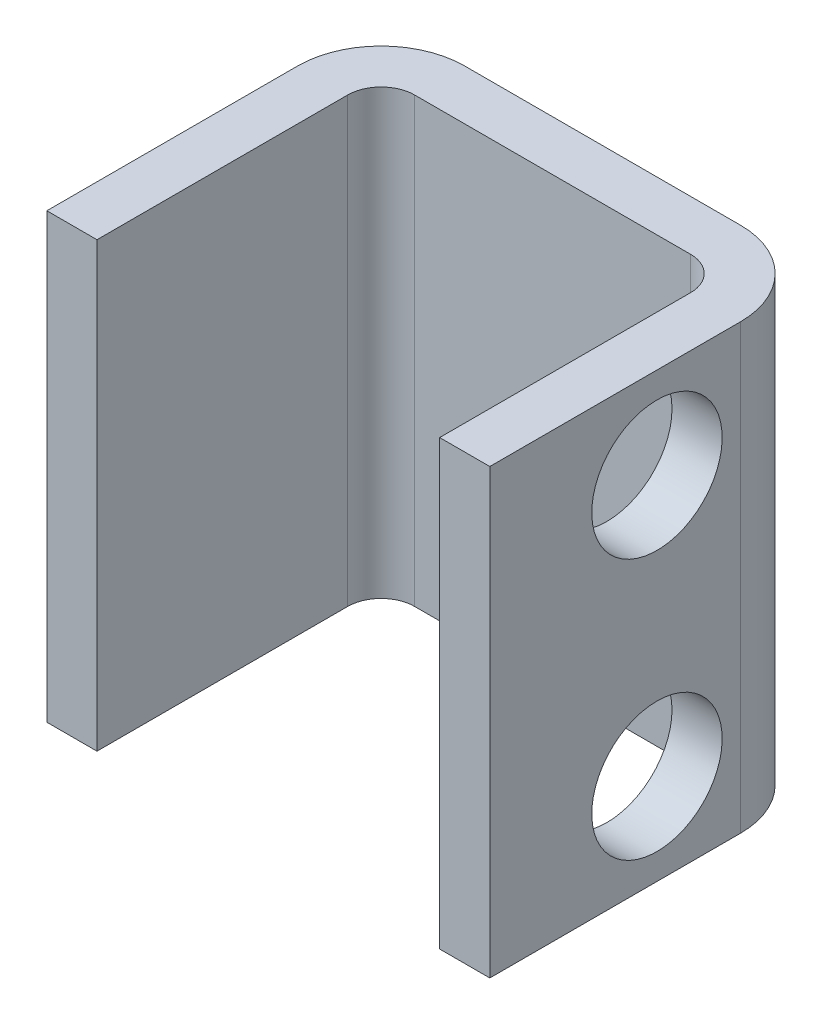
ISO-10303-21;
HEADER;
FILE_DESCRIPTION(('STEP AP214'),'2;1');
FILE_NAME('part.step','',(''),(''),'','','');
FILE_SCHEMA(('AUTOMOTIVE_DESIGN { 1 0 10303 214 1 1 1 1 }'));
ENDSEC;
DATA;
#1=APPLICATION_CONTEXT('core data for automotive mechanical design processes');
#2=APPLICATION_PROTOCOL_DEFINITION('international standard','automotive_design',2000,#1);
#3=PRODUCT_CONTEXT('',#1,'mechanical');
#4=PRODUCT('Part','Part','',(#3));
#5=PRODUCT_RELATED_PRODUCT_CATEGORY('part','',(#4));
#6=PRODUCT_DEFINITION_FORMATION('','',#4);
#7=PRODUCT_DEFINITION_CONTEXT('part definition',#1,'design');
#8=PRODUCT_DEFINITION('design','',#6,#7);
#9=PRODUCT_DEFINITION_SHAPE('','',#8);
#10=(LENGTH_UNIT() NAMED_UNIT(*) SI_UNIT(.MILLI.,.METRE.));
#11=(NAMED_UNIT(*) PLANE_ANGLE_UNIT() SI_UNIT($,.RADIAN.));
#12=(NAMED_UNIT(*) SI_UNIT($,.STERADIAN.) SOLID_ANGLE_UNIT());
#13=UNCERTAINTY_MEASURE_WITH_UNIT(LENGTH_MEASURE(1.E-05),#10,'distance_accuracy_value','');
#14=(GEOMETRIC_REPRESENTATION_CONTEXT(3) GLOBAL_UNCERTAINTY_ASSIGNED_CONTEXT((#13)) GLOBAL_UNIT_ASSIGNED_CONTEXT((#10,
#11,#12)) REPRESENTATION_CONTEXT('',''));
#15=CARTESIAN_POINT('',(0.,0.,0.));
#16=DIRECTION('',(0.,0.,1.));
#17=DIRECTION('',(1.,0.,0.));
#18=AXIS2_PLACEMENT_3D('',#15,#16,#17);
#19=CARTESIAN_POINT('',(13.25,13.25,20.));
#20=DIRECTION('',(-1.,0.,0.));
#21=DIRECTION('',(0.,-1.,0.));
#22=AXIS2_PLACEMENT_3D('',#19,#20,#21);
#23=PLANE('',#22);
#24=DIRECTION('',(0.,0.,-1.));
#25=VECTOR('',#24,1.);
#26=CARTESIAN_POINT('',(13.25,-13.25,20.));
#27=LINE('',#26,#25);
#28=CARTESIAN_POINT('',(13.25,-13.25,20.));
#29=VERTEX_POINT('',#28);
#30=CARTESIAN_POINT('',(13.25,-13.25,5.));
#31=VERTEX_POINT('',#30);
#32=EDGE_CURVE('E178',#29,#31,#27,.T.);
#33=ORIENTED_EDGE('',*,*,#32,.T.);
#34=DIRECTION('',(0.,1.,0.));
#35=VECTOR('',#34,1.);
#36=CARTESIAN_POINT('',(13.25,13.25,5.));
#37=LINE('',#36,#35);
#38=CARTESIAN_POINT('',(13.25,13.25,5.));
#39=VERTEX_POINT('',#38);
#40=EDGE_CURVE('E181',#31,#39,#37,.T.);
#41=ORIENTED_EDGE('',*,*,#40,.T.);
#42=DIRECTION('',(0.,0.,-1.));
#43=VECTOR('',#42,1.);
#44=CARTESIAN_POINT('',(13.25,13.25,20.));
#45=LINE('',#44,#43);
#46=CARTESIAN_POINT('',(13.25,13.25,20.));
#47=VERTEX_POINT('',#46);
#48=EDGE_CURVE('E174',#47,#39,#45,.T.);
#49=ORIENTED_EDGE('',*,*,#48,.F.);
#50=DIRECTION('',(0.,1.,0.));
#51=VECTOR('',#50,1.);
#52=CARTESIAN_POINT('',(13.25,13.25,20.));
#53=LINE('',#52,#51);
#54=EDGE_CURVE('E154',#29,#47,#53,.T.);
#55=ORIENTED_EDGE('',*,*,#54,.F.);
#56=EDGE_LOOP('',(#33,#41,#49,#55));
#57=FACE_BOUND('',#56,.T.);
#58=CARTESIAN_POINT('',(13.25,7.8,10.));
#59=DIRECTION('',(1.,0.,0.));
#60=DIRECTION('',(0.,1.,0.));
#61=AXIS2_PLACEMENT_3D('',#58,#59,#60);
#62=CIRCLE('',#61,3.9);
#63=CARTESIAN_POINT('',(13.25,11.7,10.));
#64=VERTEX_POINT('',#63);
#65=EDGE_CURVE('E281',#64,#64,#62,.F.);
#66=ORIENTED_EDGE('',*,*,#65,.T.);
#67=EDGE_LOOP('',(#66));
#68=FACE_BOUND('',#67,.T.);
#69=CARTESIAN_POINT('',(13.25,-7.8,10.));
#70=DIRECTION('',(1.,0.,0.));
#71=DIRECTION('',(0.,1.,0.));
#72=AXIS2_PLACEMENT_3D('',#69,#70,#71);
#73=CIRCLE('',#72,3.9);
#74=CARTESIAN_POINT('',(13.25,-3.9,10.));
#75=VERTEX_POINT('',#74);
#76=EDGE_CURVE('E285',#75,#75,#73,.T.);
#77=ORIENTED_EDGE('',*,*,#76,.F.);
#78=EDGE_LOOP('',(#77));
#79=FACE_BOUND('',#78,.T.);
#80=ADVANCED_FACE('F39',(#57,#68,#79),#23,.F.);
#81=CARTESIAN_POINT('',(10.25,13.25,20.));
#82=DIRECTION('',(-1.,0.,0.));
#83=DIRECTION('',(0.,-1.,0.));
#84=AXIS2_PLACEMENT_3D('',#81,#82,#83);
#85=PLANE('',#84);
#86=CARTESIAN_POINT('',(10.25,7.8,10.));
#87=DIRECTION('',(-1.,0.,0.));
#88=DIRECTION('',(0.,-1.,0.));
#89=AXIS2_PLACEMENT_3D('',#86,#87,#88);
#90=CIRCLE('',#89,3.9);
#91=CARTESIAN_POINT('',(10.25,3.9,10.));
#92=VERTEX_POINT('',#91);
#93=EDGE_CURVE('E283',#92,#92,#90,.F.);
#94=ORIENTED_EDGE('',*,*,#93,.T.);
#95=EDGE_LOOP('',(#94));
#96=FACE_BOUND('',#95,.T.);
#97=DIRECTION('',(0.,0.,-1.));
#98=VECTOR('',#97,1.);
#99=CARTESIAN_POINT('',(10.25,13.25,20.));
#100=LINE('',#99,#98);
#101=CARTESIAN_POINT('',(10.25,13.25,20.));
#102=VERTEX_POINT('',#101);
#103=CARTESIAN_POINT('',(10.25,13.25,5.));
#104=VERTEX_POINT('',#103);
#105=EDGE_CURVE('E271',#102,#104,#100,.T.);
#106=ORIENTED_EDGE('',*,*,#105,.T.);
#107=DIRECTION('',(0.,1.,0.));
#108=VECTOR('',#107,1.);
#109=CARTESIAN_POINT('',(10.25,-13.25,5.));
#110=LINE('',#109,#108);
#111=CARTESIAN_POINT('',(10.25,-13.25,5.));
#112=VERTEX_POINT('',#111);
#113=EDGE_CURVE('E58',#104,#112,#110,.F.);
#114=ORIENTED_EDGE('',*,*,#113,.T.);
#115=DIRECTION('',(0.,0.,-1.));
#116=VECTOR('',#115,1.);
#117=CARTESIAN_POINT('',(10.25,-13.25,20.));
#118=LINE('',#117,#116);
#119=CARTESIAN_POINT('',(10.25,-13.25,20.));
#120=VERTEX_POINT('',#119);
#121=EDGE_CURVE('E166',#120,#112,#118,.T.);
#122=ORIENTED_EDGE('',*,*,#121,.F.);
#123=DIRECTION('',(0.,1.,0.));
#124=VECTOR('',#123,1.);
#125=CARTESIAN_POINT('',(10.25,13.25,20.));
#126=LINE('',#125,#124);
#127=EDGE_CURVE('E140',#120,#102,#126,.T.);
#128=ORIENTED_EDGE('',*,*,#127,.T.);
#129=EDGE_LOOP('',(#106,#114,#122,#128));
#130=FACE_BOUND('',#129,.T.);
#131=CARTESIAN_POINT('',(10.25,-7.8,10.));
#132=DIRECTION('',(-1.,0.,0.));
#133=DIRECTION('',(0.,-1.,0.));
#134=AXIS2_PLACEMENT_3D('',#131,#132,#133);
#135=CIRCLE('',#134,3.9);
#136=CARTESIAN_POINT('',(10.25,-11.7,10.));
#137=VERTEX_POINT('',#136);
#138=EDGE_CURVE('E277',#137,#137,#135,.T.);
#139=ORIENTED_EDGE('',*,*,#138,.F.);
#140=EDGE_LOOP('',(#139));
#141=FACE_BOUND('',#140,.T.);
#142=ADVANCED_FACE('F232',(#96,#130,#141),#85,.T.);
#143=CARTESIAN_POINT('',(0.,0.,20.));
#144=DIRECTION('',(0.,0.,1.));
#145=DIRECTION('',(1.,0.,0.));
#146=AXIS2_PLACEMENT_3D('',#143,#144,#145);
#147=PLANE('',#146);
#148=ORIENTED_EDGE('',*,*,#127,.F.);
#149=DIRECTION('',(1.,0.,0.));
#150=VECTOR('',#149,1.);
#151=CARTESIAN_POINT('',(13.25,-13.25,20.));
#152=LINE('',#151,#150);
#153=EDGE_CURVE('E152',#120,#29,#152,.T.);
#154=ORIENTED_EDGE('',*,*,#153,.T.);
#155=ORIENTED_EDGE('',*,*,#54,.T.);
#156=DIRECTION('',(-1.,0.,0.));
#157=VECTOR('',#156,1.);
#158=CARTESIAN_POINT('',(13.25,13.25,20.));
#159=LINE('',#158,#157);
#160=EDGE_CURVE('E163',#47,#102,#159,.T.);
#161=ORIENTED_EDGE('',*,*,#160,.T.);
#162=EDGE_LOOP('',(#148,#154,#155,#161));
#163=FACE_BOUND('',#162,.T.);
#164=ADVANCED_FACE('F243',(#163),#147,.T.);
#165=CARTESIAN_POINT('',(13.25,-13.25,20.));
#166=DIRECTION('',(0.,1.,0.));
#167=DIRECTION('',(-1.,0.,0.));
#168=AXIS2_PLACEMENT_3D('',#165,#166,#167);
#169=PLANE('',#168);
#170=DIRECTION('',(1.,0.,0.));
#171=VECTOR('',#170,1.);
#172=CARTESIAN_POINT('',(13.25,-13.25,0.));
#173=LINE('',#172,#171);
#174=CARTESIAN_POINT('',(-8.24999999999999,-13.25,0.));
#175=VERTEX_POINT('',#174);
#176=CARTESIAN_POINT('',(8.25000000000001,-13.25,0.));
#177=VERTEX_POINT('',#176);
#178=EDGE_CURVE('E168',#175,#177,#173,.T.);
#179=ORIENTED_EDGE('',*,*,#178,.T.);
#180=CARTESIAN_POINT('',(8.25000000000001,-13.25,5.));
#181=DIRECTION('',(0.,1.,0.));
#182=DIRECTION('',(-1.,0.,0.));
#183=AXIS2_PLACEMENT_3D('',#180,#181,#182);
#184=CIRCLE('',#183,5.);
#185=EDGE_CURVE('E191',#177,#31,#184,.F.);
#186=ORIENTED_EDGE('',*,*,#185,.T.);
#187=ORIENTED_EDGE('',*,*,#32,.F.);
#188=ORIENTED_EDGE('',*,*,#153,.F.);
#189=ORIENTED_EDGE('',*,*,#121,.T.);
#190=CARTESIAN_POINT('',(8.25000000000001,-13.25,5.));
#191=DIRECTION('',(0.,1.,0.));
#192=DIRECTION('',(-1.,0.,0.));
#193=AXIS2_PLACEMENT_3D('',#190,#191,#192);
#194=CIRCLE('',#193,2.);
#195=CARTESIAN_POINT('',(8.25000000000001,-13.25,3.));
#196=VERTEX_POINT('',#195);
#197=EDGE_CURVE('E11',#112,#196,#194,.T.);
#198=ORIENTED_EDGE('',*,*,#197,.T.);
#199=DIRECTION('',(1.,0.,0.));
#200=VECTOR('',#199,1.);
#201=CARTESIAN_POINT('',(13.25,-13.25,3.));
#202=LINE('',#201,#200);
#203=CARTESIAN_POINT('',(-8.24999999999999,-13.25,3.));
#204=VERTEX_POINT('',#203);
#205=EDGE_CURVE('E216',#204,#196,#202,.T.);
#206=ORIENTED_EDGE('',*,*,#205,.F.);
#207=CARTESIAN_POINT('',(-8.24999999999999,-13.25,5.));
#208=DIRECTION('',(0.,1.,0.));
#209=DIRECTION('',(-1.,0.,0.));
#210=AXIS2_PLACEMENT_3D('',#207,#208,#209);
#211=CIRCLE('',#210,2.);
#212=CARTESIAN_POINT('',(-10.25,-13.25,5.));
#213=VERTEX_POINT('',#212);
#214=EDGE_CURVE('E147',#204,#213,#211,.T.);
#215=ORIENTED_EDGE('',*,*,#214,.T.);
#216=DIRECTION('',(0.,0.,-1.));
#217=VECTOR('',#216,1.);
#218=CARTESIAN_POINT('',(-10.25,-13.25,20.));
#219=LINE('',#218,#217);
#220=CARTESIAN_POINT('',(-10.25,-13.25,20.));
#221=VERTEX_POINT('',#220);
#222=EDGE_CURVE('E128',#221,#213,#219,.T.);
#223=ORIENTED_EDGE('',*,*,#222,.F.);
#224=CARTESIAN_POINT('',(-13.25,-13.25,20.));
#225=VERTEX_POINT('',#224);
#226=EDGE_CURVE('E144',#225,#221,#152,.T.);
#227=ORIENTED_EDGE('',*,*,#226,.F.);
#228=DIRECTION('',(0.,0.,-1.));
#229=VECTOR('',#228,1.);
#230=CARTESIAN_POINT('',(-13.25,-13.25,20.));
#231=LINE('',#230,#229);
#232=CARTESIAN_POINT('',(-13.25,-13.25,5.));
#233=VERTEX_POINT('',#232);
#234=EDGE_CURVE('E164',#225,#233,#231,.T.);
#235=ORIENTED_EDGE('',*,*,#234,.T.);
#236=CARTESIAN_POINT('',(-8.24999999999999,-13.25,5.));
#237=DIRECTION('',(0.,1.,0.));
#238=DIRECTION('',(-1.,0.,0.));
#239=AXIS2_PLACEMENT_3D('',#236,#237,#238);
#240=CIRCLE('',#239,5.);
#241=EDGE_CURVE('E195',#233,#175,#240,.F.);
#242=ORIENTED_EDGE('',*,*,#241,.T.);
#243=EDGE_LOOP('',(#179,#186,#187,#188,#189,#198,#206,#215,#223,#227,#235,#242));
#244=FACE_BOUND('',#243,.T.);
#245=ADVANCED_FACE('F145',(#244),#169,.F.);
#246=CARTESIAN_POINT('',(13.25,13.25,20.));
#247=DIRECTION('',(0.,-1.,0.));
#248=DIRECTION('',(0.,0.,-1.));
#249=AXIS2_PLACEMENT_3D('',#246,#247,#248);
#250=PLANE('',#249);
#251=ORIENTED_EDGE('',*,*,#48,.T.);
#252=CARTESIAN_POINT('',(8.25,13.25,5.));
#253=DIRECTION('',(0.,-1.,0.));
#254=DIRECTION('',(0.,0.,-1.));
#255=AXIS2_PLACEMENT_3D('',#252,#253,#254);
#256=CIRCLE('',#255,5.);
#257=CARTESIAN_POINT('',(8.25,13.25,0.));
#258=VERTEX_POINT('',#257);
#259=EDGE_CURVE('E187',#39,#258,#256,.F.);
#260=ORIENTED_EDGE('',*,*,#259,.T.);
#261=DIRECTION('',(-1.,0.,0.));
#262=VECTOR('',#261,1.);
#263=CARTESIAN_POINT('',(13.25,13.25,0.));
#264=LINE('',#263,#262);
#265=CARTESIAN_POINT('',(-8.24999999999999,13.25,0.));
#266=VERTEX_POINT('',#265);
#267=EDGE_CURVE('E160',#258,#266,#264,.T.);
#268=ORIENTED_EDGE('',*,*,#267,.T.);
#269=CARTESIAN_POINT('',(-8.24999999999999,13.25,5.));
#270=DIRECTION('',(0.,-1.,0.));
#271=DIRECTION('',(0.,0.,-1.));
#272=AXIS2_PLACEMENT_3D('',#269,#270,#271);
#273=CIRCLE('',#272,5.);
#274=CARTESIAN_POINT('',(-13.25,13.25,5.));
#275=VERTEX_POINT('',#274);
#276=EDGE_CURVE('E183',#266,#275,#273,.F.);
#277=ORIENTED_EDGE('',*,*,#276,.T.);
#278=DIRECTION('',(0.,0.,-1.));
#279=VECTOR('',#278,1.);
#280=CARTESIAN_POINT('',(-13.25,13.25,20.));
#281=LINE('',#280,#279);
#282=CARTESIAN_POINT('',(-13.25,13.25,20.));
#283=VERTEX_POINT('',#282);
#284=EDGE_CURVE('E175',#283,#275,#281,.T.);
#285=ORIENTED_EDGE('',*,*,#284,.F.);
#286=CARTESIAN_POINT('',(-10.25,13.25,20.));
#287=VERTEX_POINT('',#286);
#288=EDGE_CURVE('E151',#287,#283,#159,.T.);
#289=ORIENTED_EDGE('',*,*,#288,.F.);
#290=DIRECTION('',(0.,0.,-1.));
#291=VECTOR('',#290,1.);
#292=CARTESIAN_POINT('',(-10.25,13.25,20.));
#293=LINE('',#292,#291);
#294=CARTESIAN_POINT('',(-10.25,13.25,5.));
#295=VERTEX_POINT('',#294);
#296=EDGE_CURVE('E132',#287,#295,#293,.T.);
#297=ORIENTED_EDGE('',*,*,#296,.T.);
#298=CARTESIAN_POINT('',(-8.24999999999999,13.25,5.));
#299=DIRECTION('',(0.,-1.,0.));
#300=DIRECTION('',(0.,0.,-1.));
#301=AXIS2_PLACEMENT_3D('',#298,#299,#300);
#302=CIRCLE('',#301,2.);
#303=CARTESIAN_POINT('',(-8.24999999999999,13.25,3.));
#304=VERTEX_POINT('',#303);
#305=EDGE_CURVE('E209',#295,#304,#302,.T.);
#306=ORIENTED_EDGE('',*,*,#305,.T.);
#307=DIRECTION('',(-1.,0.,0.));
#308=VECTOR('',#307,1.);
#309=CARTESIAN_POINT('',(13.25,13.25,3.));
#310=LINE('',#309,#308);
#311=CARTESIAN_POINT('',(8.25000000000001,13.25,3.));
#312=VERTEX_POINT('',#311);
#313=EDGE_CURVE('E214',#312,#304,#310,.T.);
#314=ORIENTED_EDGE('',*,*,#313,.F.);
#315=CARTESIAN_POINT('',(8.25000000000001,13.25,5.));
#316=DIRECTION('',(0.,-1.,0.));
#317=DIRECTION('',(0.,0.,-1.));
#318=AXIS2_PLACEMENT_3D('',#315,#316,#317);
#319=CIRCLE('',#318,2.);
#320=EDGE_CURVE('E50',#312,#104,#319,.T.);
#321=ORIENTED_EDGE('',*,*,#320,.T.);
#322=ORIENTED_EDGE('',*,*,#105,.F.);
#323=ORIENTED_EDGE('',*,*,#160,.F.);
#324=EDGE_LOOP('',(#251,#260,#268,#277,#285,#289,#297,#306,#314,#321,#322,#323));
#325=FACE_BOUND('',#324,.T.);
#326=ADVANCED_FACE('F215',(#325),#250,.F.);
#327=CARTESIAN_POINT('',(-13.25,13.25,20.));
#328=DIRECTION('',(1.,0.,0.));
#329=DIRECTION('',(0.,1.,0.));
#330=AXIS2_PLACEMENT_3D('',#327,#328,#329);
#331=PLANE('',#330);
#332=ORIENTED_EDGE('',*,*,#284,.T.);
#333=DIRECTION('',(0.,-1.,0.));
#334=VECTOR('',#333,1.);
#335=CARTESIAN_POINT('',(-13.25,13.25,5.));
#336=LINE('',#335,#334);
#337=EDGE_CURVE('E198',#275,#233,#336,.T.);
#338=ORIENTED_EDGE('',*,*,#337,.T.);
#339=ORIENTED_EDGE('',*,*,#234,.F.);
#340=DIRECTION('',(0.,-1.,0.));
#341=VECTOR('',#340,1.);
#342=CARTESIAN_POINT('',(-13.25,13.25,20.));
#343=LINE('',#342,#341);
#344=EDGE_CURVE('E148',#283,#225,#343,.T.);
#345=ORIENTED_EDGE('',*,*,#344,.F.);
#346=EDGE_LOOP('',(#332,#338,#339,#345));
#347=FACE_BOUND('',#346,.T.);
#348=ADVANCED_FACE('F310',(#347),#331,.F.);
#349=DIRECTION('',(0.,-1.,0.));
#350=VECTOR('',#349,1.);
#351=CARTESIAN_POINT('',(-10.25,13.25,20.));
#352=LINE('',#351,#350);
#353=EDGE_CURVE('E130',#287,#221,#352,.T.);
#354=ORIENTED_EDGE('',*,*,#353,.F.);
#355=ORIENTED_EDGE('',*,*,#288,.T.);
#356=ORIENTED_EDGE('',*,*,#344,.T.);
#357=ORIENTED_EDGE('',*,*,#226,.T.);
#358=EDGE_LOOP('',(#354,#355,#356,#357));
#359=FACE_BOUND('',#358,.T.);
#360=ADVANCED_FACE('F149',(#359),#147,.T.);
#361=CARTESIAN_POINT('',(0.,0.,0.));
#362=DIRECTION('',(0.,0.,1.));
#363=DIRECTION('',(1.,0.,0.));
#364=AXIS2_PLACEMENT_3D('',#361,#362,#363);
#365=PLANE('',#364);
#366=ORIENTED_EDGE('',*,*,#267,.F.);
#367=DIRECTION('',(0.,1.,0.));
#368=VECTOR('',#367,1.);
#369=CARTESIAN_POINT('',(8.25,0.,0.));
#370=LINE('',#369,#368);
#371=EDGE_CURVE('E188',#258,#177,#370,.F.);
#372=ORIENTED_EDGE('',*,*,#371,.T.);
#373=ORIENTED_EDGE('',*,*,#178,.F.);
#374=DIRECTION('',(0.,-1.,0.));
#375=VECTOR('',#374,1.);
#376=CARTESIAN_POINT('',(-8.24999999999999,0.,0.));
#377=LINE('',#376,#375);
#378=EDGE_CURVE('E189',#175,#266,#377,.F.);
#379=ORIENTED_EDGE('',*,*,#378,.T.);
#380=EDGE_LOOP('',(#366,#372,#373,#379));
#381=FACE_BOUND('',#380,.T.);
#382=ADVANCED_FACE('F302',(#381),#365,.F.);
#383=CARTESIAN_POINT('',(-10.25,13.25,20.));
#384=DIRECTION('',(1.,0.,0.));
#385=DIRECTION('',(0.,1.,0.));
#386=AXIS2_PLACEMENT_3D('',#383,#384,#385);
#387=PLANE('',#386);
#388=ORIENTED_EDGE('',*,*,#222,.T.);
#389=DIRECTION('',(0.,-1.,0.));
#390=VECTOR('',#389,1.);
#391=CARTESIAN_POINT('',(-10.25,13.25,5.));
#392=LINE('',#391,#390);
#393=EDGE_CURVE('E203',#213,#295,#392,.F.);
#394=ORIENTED_EDGE('',*,*,#393,.T.);
#395=ORIENTED_EDGE('',*,*,#296,.F.);
#396=ORIENTED_EDGE('',*,*,#353,.T.);
#397=EDGE_LOOP('',(#388,#394,#395,#396));
#398=FACE_BOUND('',#397,.T.);
#399=ADVANCED_FACE('F126',(#398),#387,.T.);
#400=CARTESIAN_POINT('',(0.,0.,3.));
#401=DIRECTION('',(0.,0.,1.));
#402=DIRECTION('',(1.,0.,0.));
#403=AXIS2_PLACEMENT_3D('',#400,#401,#402);
#404=PLANE('',#403);
#405=ORIENTED_EDGE('',*,*,#313,.T.);
#406=DIRECTION('',(0.,-1.,0.));
#407=VECTOR('',#406,1.);
#408=CARTESIAN_POINT('',(-8.24999999999999,-13.25,3.));
#409=LINE('',#408,#407);
#410=EDGE_CURVE('E205',#304,#204,#409,.T.);
#411=ORIENTED_EDGE('',*,*,#410,.T.);
#412=ORIENTED_EDGE('',*,*,#205,.T.);
#413=DIRECTION('',(0.,1.,0.));
#414=VECTOR('',#413,1.);
#415=CARTESIAN_POINT('',(8.25000000000001,13.25,3.));
#416=LINE('',#415,#414);
#417=EDGE_CURVE('E200',#196,#312,#416,.T.);
#418=ORIENTED_EDGE('',*,*,#417,.T.);
#419=EDGE_LOOP('',(#405,#411,#412,#418));
#420=FACE_BOUND('',#419,.T.);
#421=ADVANCED_FACE('F219',(#420),#404,.T.);
#422=CARTESIAN_POINT('',(-21.2808657865101,7.8,10.));
#423=DIRECTION('',(1.,0.,0.));
#424=DIRECTION('',(0.,1.,0.));
#425=AXIS2_PLACEMENT_3D('',#422,#423,#424);
#426=CYLINDRICAL_SURFACE('',#425,3.9);
#427=ORIENTED_EDGE('',*,*,#93,.F.);
#428=EDGE_LOOP('',(#427));
#429=FACE_BOUND('',#428,.T.);
#430=ORIENTED_EDGE('',*,*,#65,.F.);
#431=EDGE_LOOP('',(#430));
#432=FACE_BOUND('',#431,.T.);
#433=ADVANCED_FACE('F259',(#429,#432),#426,.F.);
#434=CARTESIAN_POINT('',(-21.2808657865101,-7.8,10.));
#435=DIRECTION('',(1.,0.,0.));
#436=DIRECTION('',(0.,1.,0.));
#437=AXIS2_PLACEMENT_3D('',#434,#435,#436);
#438=CYLINDRICAL_SURFACE('',#437,3.9);
#439=ORIENTED_EDGE('',*,*,#138,.T.);
#440=EDGE_LOOP('',(#439));
#441=FACE_BOUND('',#440,.T.);
#442=ORIENTED_EDGE('',*,*,#76,.T.);
#443=EDGE_LOOP('',(#442));
#444=FACE_BOUND('',#443,.T.);
#445=ADVANCED_FACE('F254',(#441,#444),#438,.F.);
#446=CARTESIAN_POINT('',(8.25,13.25,5.));
#447=DIRECTION('',(0.,1.,0.));
#448=DIRECTION('',(-1.,0.,0.));
#449=AXIS2_PLACEMENT_3D('',#446,#447,#448);
#450=CYLINDRICAL_SURFACE('',#449,5.);
#451=ORIENTED_EDGE('',*,*,#185,.F.);
#452=ORIENTED_EDGE('',*,*,#371,.F.);
#453=ORIENTED_EDGE('',*,*,#259,.F.);
#454=ORIENTED_EDGE('',*,*,#40,.F.);
#455=EDGE_LOOP('',(#451,#452,#453,#454));
#456=FACE_BOUND('',#455,.T.);
#457=ADVANCED_FACE('F233',(#456),#450,.T.);
#458=CARTESIAN_POINT('',(-8.24999999999999,13.25,5.));
#459=DIRECTION('',(0.,-1.,0.));
#460=DIRECTION('',(1.,0.,0.));
#461=AXIS2_PLACEMENT_3D('',#458,#459,#460);
#462=CYLINDRICAL_SURFACE('',#461,5.);
#463=ORIENTED_EDGE('',*,*,#276,.F.);
#464=ORIENTED_EDGE('',*,*,#378,.F.);
#465=ORIENTED_EDGE('',*,*,#241,.F.);
#466=ORIENTED_EDGE('',*,*,#337,.F.);
#467=EDGE_LOOP('',(#463,#464,#465,#466));
#468=FACE_BOUND('',#467,.T.);
#469=ADVANCED_FACE('F221',(#468),#462,.T.);
#470=CARTESIAN_POINT('',(-8.24999999999999,0.,5.));
#471=DIRECTION('',(0.,1.,0.));
#472=DIRECTION('',(-1.,0.,0.));
#473=AXIS2_PLACEMENT_3D('',#470,#471,#472);
#474=CYLINDRICAL_SURFACE('',#473,2.);
#475=ORIENTED_EDGE('',*,*,#305,.F.);
#476=ORIENTED_EDGE('',*,*,#393,.F.);
#477=ORIENTED_EDGE('',*,*,#214,.F.);
#478=ORIENTED_EDGE('',*,*,#410,.F.);
#479=EDGE_LOOP('',(#475,#476,#477,#478));
#480=FACE_BOUND('',#479,.T.);
#481=ADVANCED_FACE('F225',(#480),#474,.F.);
#482=CARTESIAN_POINT('',(8.25000000000001,0.,5.));
#483=DIRECTION('',(0.,-1.,0.));
#484=DIRECTION('',(1.,0.,0.));
#485=AXIS2_PLACEMENT_3D('',#482,#483,#484);
#486=CYLINDRICAL_SURFACE('',#485,2.);
#487=ORIENTED_EDGE('',*,*,#197,.F.);
#488=ORIENTED_EDGE('',*,*,#113,.F.);
#489=ORIENTED_EDGE('',*,*,#320,.F.);
#490=ORIENTED_EDGE('',*,*,#417,.F.);
#491=EDGE_LOOP('',(#487,#488,#489,#490));
#492=FACE_BOUND('',#491,.T.);
#493=ADVANCED_FACE('F41',(#492),#486,.F.);
#494=CLOSED_SHELL('',(#80,#142,#164,#245,#326,#348,#360,#382,#399,#421,#433,#445,#457,#469,#481,#493));
#495=MANIFOLD_SOLID_BREP('B2',#494);
#496=ADVANCED_BREP_SHAPE_REPRESENTATION('',(#18,#495),#14);
#497=SHAPE_DEFINITION_REPRESENTATION(#9,#496);
ENDSEC;
END-ISO-10303-21;
